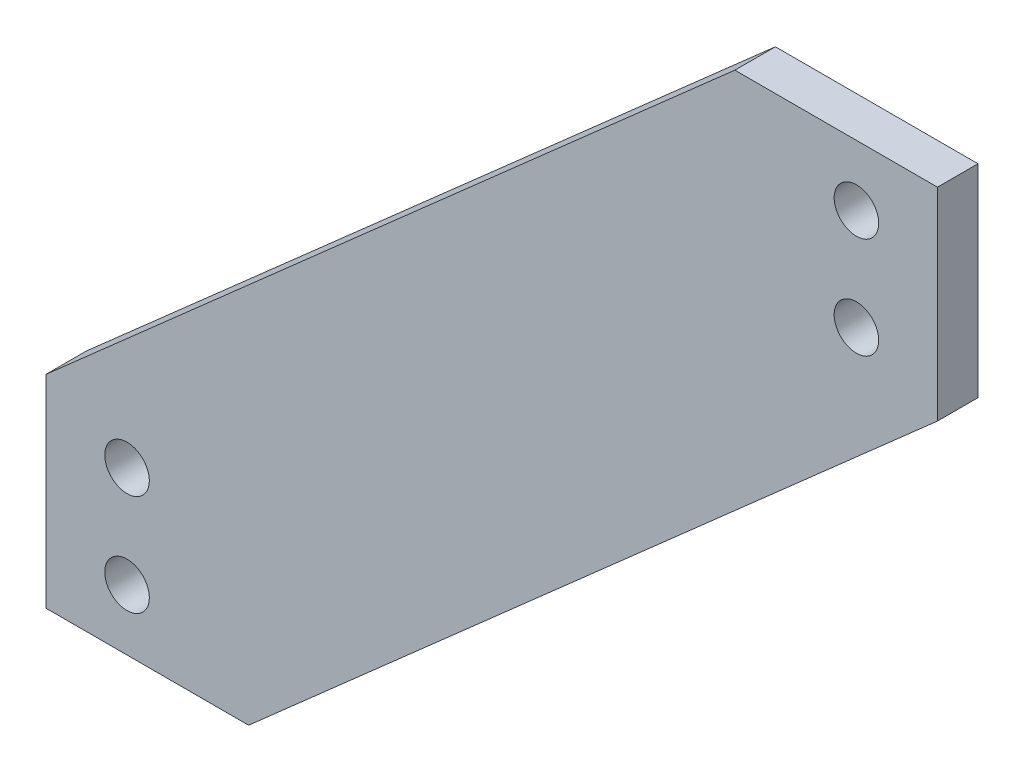
ISO-10303-21;
HEADER;
FILE_DESCRIPTION(('STEP AP214'),'2;1');
FILE_NAME('part.step','',(''),(''),'','','');
FILE_SCHEMA(('AUTOMOTIVE_DESIGN { 1 0 10303 214 1 1 1 1 }'));
ENDSEC;
DATA;
#1=APPLICATION_CONTEXT('core data for automotive mechanical design processes');
#2=APPLICATION_PROTOCOL_DEFINITION('international standard','automotive_design',2000,#1);
#3=PRODUCT_CONTEXT('',#1,'mechanical');
#4=PRODUCT('Part','Part','',(#3));
#5=PRODUCT_RELATED_PRODUCT_CATEGORY('part','',(#4));
#6=PRODUCT_DEFINITION_FORMATION('','',#4);
#7=PRODUCT_DEFINITION_CONTEXT('part definition',#1,'design');
#8=PRODUCT_DEFINITION('design','',#6,#7);
#9=PRODUCT_DEFINITION_SHAPE('','',#8);
#10=(LENGTH_UNIT() NAMED_UNIT(*) SI_UNIT(.MILLI.,.METRE.));
#11=(NAMED_UNIT(*) PLANE_ANGLE_UNIT() SI_UNIT($,.RADIAN.));
#12=(NAMED_UNIT(*) SI_UNIT($,.STERADIAN.) SOLID_ANGLE_UNIT());
#13=UNCERTAINTY_MEASURE_WITH_UNIT(LENGTH_MEASURE(1.E-05),#10,'distance_accuracy_value','');
#14=(GEOMETRIC_REPRESENTATION_CONTEXT(3) GLOBAL_UNCERTAINTY_ASSIGNED_CONTEXT((#13)) GLOBAL_UNIT_ASSIGNED_CONTEXT((#10,
#11,#12)) REPRESENTATION_CONTEXT('',''));
#15=CARTESIAN_POINT('',(0.,0.,0.));
#16=DIRECTION('',(0.,0.,1.));
#17=DIRECTION('',(1.,0.,0.));
#18=AXIS2_PLACEMENT_3D('',#15,#16,#17);
#19=CARTESIAN_POINT('',(0.,0.,-148.660687473185));
#20=DIRECTION('',(-1.,0.,0.));
#21=DIRECTION('',(0.,0.,1.));
#22=AXIS2_PLACEMENT_3D('',#19,#20,#21);
#23=PLANE('',#22);
#24=DIRECTION('',(0.,1.,0.));
#25=VECTOR('',#24,1.);
#26=CARTESIAN_POINT('',(0.,0.,0.));
#27=LINE('',#26,#25);
#28=CARTESIAN_POINT('',(0.,0.,0.));
#29=VERTEX_POINT('',#28);
#30=CARTESIAN_POINT('',(0.,25.,0.));
#31=VERTEX_POINT('',#30);
#32=EDGE_CURVE('E63',#29,#31,#27,.T.);
#33=ORIENTED_EDGE('',*,*,#32,.F.);
#34=DIRECTION('',(0.,0.,-1.));
#35=VECTOR('',#34,1.);
#36=CARTESIAN_POINT('',(0.,0.,5.));
#37=LINE('',#36,#35);
#38=CARTESIAN_POINT('',(0.,0.,5.));
#39=VERTEX_POINT('',#38);
#40=EDGE_CURVE('E11',#39,#29,#37,.T.);
#41=ORIENTED_EDGE('',*,*,#40,.F.);
#42=DIRECTION('',(0.,-1.,0.));
#43=VECTOR('',#42,1.);
#44=CARTESIAN_POINT('',(0.,0.,5.));
#45=LINE('',#44,#43);
#46=CARTESIAN_POINT('',(0.,25.,5.));
#47=VERTEX_POINT('',#46);
#48=EDGE_CURVE('E102',#47,#39,#45,.T.);
#49=ORIENTED_EDGE('',*,*,#48,.F.);
#50=DIRECTION('',(0.,0.,1.));
#51=VECTOR('',#50,1.);
#52=CARTESIAN_POINT('',(0.,25.,-148.660687473185));
#53=LINE('',#52,#51);
#54=EDGE_CURVE('E137',#31,#47,#53,.T.);
#55=ORIENTED_EDGE('',*,*,#54,.F.);
#56=EDGE_LOOP('',(#33,#41,#49,#55));
#57=FACE_BOUND('',#56,.T.);
#58=ADVANCED_FACE('F39',(#57),#23,.T.);
#59=CARTESIAN_POINT('',(0.,25.,-148.660687473185));
#60=DIRECTION('',(-0.661621637086846,0.749837855365093,0.));
#61=DIRECTION('',(-0.749837855365093,-0.661621637086846,0.));
#62=AXIS2_PLACEMENT_3D('',#59,#60,#61);
#63=PLANE('',#62);
#64=DIRECTION('',(0.749837855365093,0.661621637086846,0.));
#65=VECTOR('',#64,1.);
#66=CARTESIAN_POINT('',(0.,25.,0.));
#67=LINE('',#66,#65);
#68=CARTESIAN_POINT('',(85.,100.,0.));
#69=VERTEX_POINT('',#68);
#70=EDGE_CURVE('E163',#31,#69,#67,.T.);
#71=ORIENTED_EDGE('',*,*,#70,.F.);
#72=ORIENTED_EDGE('',*,*,#54,.T.);
#73=DIRECTION('',(-0.749837855365093,-0.661621637086846,0.));
#74=VECTOR('',#73,1.);
#75=CARTESIAN_POINT('',(0.,25.,5.));
#76=LINE('',#75,#74);
#77=CARTESIAN_POINT('',(85.,100.,5.));
#78=VERTEX_POINT('',#77);
#79=EDGE_CURVE('E125',#78,#47,#76,.T.);
#80=ORIENTED_EDGE('',*,*,#79,.F.);
#81=DIRECTION('',(0.,0.,1.));
#82=VECTOR('',#81,1.);
#83=CARTESIAN_POINT('',(85.,100.,-148.660687473185));
#84=LINE('',#83,#82);
#85=EDGE_CURVE('E140',#69,#78,#84,.T.);
#86=ORIENTED_EDGE('',*,*,#85,.F.);
#87=EDGE_LOOP('',(#71,#72,#80,#86));
#88=FACE_BOUND('',#87,.T.);
#89=ADVANCED_FACE('F168',(#88),#63,.T.);
#90=CARTESIAN_POINT('',(0.,0.,5.));
#91=DIRECTION('',(0.,1.,0.));
#92=DIRECTION('',(0.,0.,1.));
#93=AXIS2_PLACEMENT_3D('',#90,#91,#92);
#94=PLANE('',#93);
#95=DIRECTION('',(1.,0.,0.));
#96=VECTOR('',#95,1.);
#97=CARTESIAN_POINT('',(0.,0.,0.));
#98=LINE('',#97,#96);
#99=CARTESIAN_POINT('',(25.,0.,0.));
#100=VERTEX_POINT('',#99);
#101=EDGE_CURVE('E110',#29,#100,#98,.T.);
#102=ORIENTED_EDGE('',*,*,#101,.T.);
#103=DIRECTION('',(0.,0.,1.));
#104=VECTOR('',#103,1.);
#105=CARTESIAN_POINT('',(25.,0.,-148.660687473185));
#106=LINE('',#105,#104);
#107=CARTESIAN_POINT('',(25.,0.,5.));
#108=VERTEX_POINT('',#107);
#109=EDGE_CURVE('E109',#100,#108,#106,.T.);
#110=ORIENTED_EDGE('',*,*,#109,.T.);
#111=DIRECTION('',(1.,0.,0.));
#112=VECTOR('',#111,1.);
#113=CARTESIAN_POINT('',(0.,0.,5.));
#114=LINE('',#113,#112);
#115=EDGE_CURVE('E94',#39,#108,#114,.T.);
#116=ORIENTED_EDGE('',*,*,#115,.F.);
#117=ORIENTED_EDGE('',*,*,#40,.T.);
#118=EDGE_LOOP('',(#102,#110,#116,#117));
#119=FACE_BOUND('',#118,.T.);
#120=ADVANCED_FACE('F41',(#119),#94,.F.);
#121=CARTESIAN_POINT('',(110.,100.,5.));
#122=DIRECTION('',(0.,-1.,0.));
#123=DIRECTION('',(0.,0.,-1.));
#124=AXIS2_PLACEMENT_3D('',#121,#122,#123);
#125=PLANE('',#124);
#126=DIRECTION('',(-1.,0.,0.));
#127=VECTOR('',#126,1.);
#128=CARTESIAN_POINT('',(110.,100.,0.));
#129=LINE('',#128,#127);
#130=CARTESIAN_POINT('',(110.,100.,0.));
#131=VERTEX_POINT('',#130);
#132=EDGE_CURVE('E106',#131,#69,#129,.T.);
#133=ORIENTED_EDGE('',*,*,#132,.T.);
#134=ORIENTED_EDGE('',*,*,#85,.T.);
#135=DIRECTION('',(-1.,0.,0.));
#136=VECTOR('',#135,1.);
#137=CARTESIAN_POINT('',(110.,100.,5.));
#138=LINE('',#137,#136);
#139=CARTESIAN_POINT('',(110.,100.,5.));
#140=VERTEX_POINT('',#139);
#141=EDGE_CURVE('E105',#140,#78,#138,.T.);
#142=ORIENTED_EDGE('',*,*,#141,.F.);
#143=DIRECTION('',(0.,0.,-1.));
#144=VECTOR('',#143,1.);
#145=CARTESIAN_POINT('',(110.,100.,5.));
#146=LINE('',#145,#144);
#147=EDGE_CURVE('E48',#140,#131,#146,.T.);
#148=ORIENTED_EDGE('',*,*,#147,.T.);
#149=EDGE_LOOP('',(#133,#134,#142,#148));
#150=FACE_BOUND('',#149,.T.);
#151=ADVANCED_FACE('F158',(#150),#125,.F.);
#152=CARTESIAN_POINT('',(0.,0.,5.));
#153=DIRECTION('',(0.,0.,1.));
#154=DIRECTION('',(1.,0.,0.));
#155=AXIS2_PLACEMENT_3D('',#152,#153,#154);
#156=PLANE('',#155);
#157=CARTESIAN_POINT('',(100.,80.,5.));
#158=DIRECTION('',(0.,0.,1.));
#159=DIRECTION('',(1.,0.,0.));
#160=AXIS2_PLACEMENT_3D('',#157,#158,#159);
#161=CIRCLE('',#160,2.74999999999999);
#162=CARTESIAN_POINT('',(102.75,80.,5.));
#163=VERTEX_POINT('',#162);
#164=EDGE_CURVE('E295',#163,#163,#161,.T.);
#165=ORIENTED_EDGE('',*,*,#164,.F.);
#166=EDGE_LOOP('',(#165));
#167=FACE_BOUND('',#166,.T.);
#168=CARTESIAN_POINT('',(10.,20.,5.));
#169=DIRECTION('',(0.,0.,1.));
#170=DIRECTION('',(1.,0.,0.));
#171=AXIS2_PLACEMENT_3D('',#168,#169,#170);
#172=CIRCLE('',#171,2.74999999999999);
#173=CARTESIAN_POINT('',(12.75,20.,5.));
#174=VERTEX_POINT('',#173);
#175=EDGE_CURVE('E299',#174,#174,#172,.T.);
#176=ORIENTED_EDGE('',*,*,#175,.F.);
#177=EDGE_LOOP('',(#176));
#178=FACE_BOUND('',#177,.T.);
#179=CARTESIAN_POINT('',(10.,7.5,5.));
#180=DIRECTION('',(0.,0.,1.));
#181=DIRECTION('',(1.,0.,0.));
#182=AXIS2_PLACEMENT_3D('',#179,#180,#181);
#183=CIRCLE('',#182,2.74999999999999);
#184=CARTESIAN_POINT('',(12.75,7.5,5.));
#185=VERTEX_POINT('',#184);
#186=EDGE_CURVE('E309',#185,#185,#183,.T.);
#187=ORIENTED_EDGE('',*,*,#186,.F.);
#188=EDGE_LOOP('',(#187));
#189=FACE_BOUND('',#188,.T.);
#190=CARTESIAN_POINT('',(100.,92.5,5.));
#191=DIRECTION('',(0.,0.,1.));
#192=DIRECTION('',(1.,0.,0.));
#193=AXIS2_PLACEMENT_3D('',#190,#191,#192);
#194=CIRCLE('',#193,2.74999999999999);
#195=CARTESIAN_POINT('',(102.75,92.5,5.));
#196=VERTEX_POINT('',#195);
#197=EDGE_CURVE('E128',#196,#196,#194,.T.);
#198=ORIENTED_EDGE('',*,*,#197,.F.);
#199=EDGE_LOOP('',(#198));
#200=FACE_BOUND('',#199,.T.);
#201=ORIENTED_EDGE('',*,*,#141,.T.);
#202=ORIENTED_EDGE('',*,*,#79,.T.);
#203=ORIENTED_EDGE('',*,*,#48,.T.);
#204=ORIENTED_EDGE('',*,*,#115,.T.);
#205=DIRECTION('',(0.749837855365092,0.661621637086846,0.));
#206=VECTOR('',#205,1.);
#207=CARTESIAN_POINT('',(110.,75.,5.));
#208=LINE('',#207,#206);
#209=CARTESIAN_POINT('',(110.,75.,5.));
#210=VERTEX_POINT('',#209);
#211=EDGE_CURVE('E99',#108,#210,#208,.T.);
#212=ORIENTED_EDGE('',*,*,#211,.T.);
#213=DIRECTION('',(0.,1.,0.));
#214=VECTOR('',#213,1.);
#215=CARTESIAN_POINT('',(110.,100.,5.));
#216=LINE('',#215,#214);
#217=EDGE_CURVE('E120',#210,#140,#216,.T.);
#218=ORIENTED_EDGE('',*,*,#217,.T.);
#219=EDGE_LOOP('',(#201,#202,#203,#204,#212,#218));
#220=FACE_BOUND('',#219,.T.);
#221=ADVANCED_FACE('F96',(#167,#178,#189,#200,#220),#156,.T.);
#222=CARTESIAN_POINT('',(0.,0.,0.));
#223=DIRECTION('',(0.,0.,1.));
#224=DIRECTION('',(1.,0.,0.));
#225=AXIS2_PLACEMENT_3D('',#222,#223,#224);
#226=PLANE('',#225);
#227=CARTESIAN_POINT('',(100.,80.,0.));
#228=DIRECTION('',(0.,0.,1.));
#229=DIRECTION('',(1.,0.,0.));
#230=AXIS2_PLACEMENT_3D('',#227,#228,#229);
#231=CIRCLE('',#230,2.75);
#232=CARTESIAN_POINT('',(102.75,80.,0.));
#233=VERTEX_POINT('',#232);
#234=EDGE_CURVE('E292',#233,#233,#231,.T.);
#235=ORIENTED_EDGE('',*,*,#234,.T.);
#236=EDGE_LOOP('',(#235));
#237=FACE_BOUND('',#236,.T.);
#238=CARTESIAN_POINT('',(10.,20.,0.));
#239=DIRECTION('',(0.,0.,1.));
#240=DIRECTION('',(1.,0.,0.));
#241=AXIS2_PLACEMENT_3D('',#238,#239,#240);
#242=CIRCLE('',#241,2.75);
#243=CARTESIAN_POINT('',(12.75,20.,0.));
#244=VERTEX_POINT('',#243);
#245=EDGE_CURVE('E305',#244,#244,#242,.T.);
#246=ORIENTED_EDGE('',*,*,#245,.T.);
#247=EDGE_LOOP('',(#246));
#248=FACE_BOUND('',#247,.T.);
#249=CARTESIAN_POINT('',(10.,7.5,0.));
#250=DIRECTION('',(0.,0.,1.));
#251=DIRECTION('',(1.,0.,0.));
#252=AXIS2_PLACEMENT_3D('',#249,#250,#251);
#253=CIRCLE('',#252,2.75);
#254=CARTESIAN_POINT('',(12.75,7.5,0.));
#255=VERTEX_POINT('',#254);
#256=EDGE_CURVE('E313',#255,#255,#253,.T.);
#257=ORIENTED_EDGE('',*,*,#256,.T.);
#258=EDGE_LOOP('',(#257));
#259=FACE_BOUND('',#258,.T.);
#260=CARTESIAN_POINT('',(100.,92.5,0.));
#261=DIRECTION('',(0.,0.,1.));
#262=DIRECTION('',(1.,0.,0.));
#263=AXIS2_PLACEMENT_3D('',#260,#261,#262);
#264=CIRCLE('',#263,2.75);
#265=CARTESIAN_POINT('',(102.75,92.5,0.));
#266=VERTEX_POINT('',#265);
#267=EDGE_CURVE('E121',#266,#266,#264,.T.);
#268=ORIENTED_EDGE('',*,*,#267,.T.);
#269=EDGE_LOOP('',(#268));
#270=FACE_BOUND('',#269,.T.);
#271=ORIENTED_EDGE('',*,*,#101,.F.);
#272=ORIENTED_EDGE('',*,*,#32,.T.);
#273=ORIENTED_EDGE('',*,*,#70,.T.);
#274=ORIENTED_EDGE('',*,*,#132,.F.);
#275=DIRECTION('',(0.,-1.,0.));
#276=VECTOR('',#275,1.);
#277=CARTESIAN_POINT('',(110.,100.,0.));
#278=LINE('',#277,#276);
#279=CARTESIAN_POINT('',(110.,75.,0.));
#280=VERTEX_POINT('',#279);
#281=EDGE_CURVE('E55',#131,#280,#278,.T.);
#282=ORIENTED_EDGE('',*,*,#281,.T.);
#283=DIRECTION('',(-0.749837855365092,-0.661621637086847,0.));
#284=VECTOR('',#283,1.);
#285=CARTESIAN_POINT('',(110.,75.,0.));
#286=LINE('',#285,#284);
#287=EDGE_CURVE('E146',#280,#100,#286,.T.);
#288=ORIENTED_EDGE('',*,*,#287,.T.);
#289=EDGE_LOOP('',(#271,#272,#273,#274,#282,#288));
#290=FACE_BOUND('',#289,.T.);
#291=ADVANCED_FACE('F161',(#237,#248,#259,#270,#290),#226,.F.);
#292=CARTESIAN_POINT('',(110.,75.,-148.660687473185));
#293=DIRECTION('',(0.661621637086847,-0.749837855365092,0.));
#294=DIRECTION('',(0.749837855365092,0.661621637086847,0.));
#295=AXIS2_PLACEMENT_3D('',#292,#293,#294);
#296=PLANE('',#295);
#297=ORIENTED_EDGE('',*,*,#287,.F.);
#298=DIRECTION('',(0.,0.,1.));
#299=VECTOR('',#298,1.);
#300=CARTESIAN_POINT('',(110.,75.,-148.660687473185));
#301=LINE('',#300,#299);
#302=EDGE_CURVE('E115',#280,#210,#301,.T.);
#303=ORIENTED_EDGE('',*,*,#302,.T.);
#304=ORIENTED_EDGE('',*,*,#211,.F.);
#305=ORIENTED_EDGE('',*,*,#109,.F.);
#306=EDGE_LOOP('',(#297,#303,#304,#305));
#307=FACE_BOUND('',#306,.T.);
#308=ADVANCED_FACE('F117',(#307),#296,.T.);
#309=CARTESIAN_POINT('',(110.,100.,-148.660687473185));
#310=DIRECTION('',(1.,0.,0.));
#311=DIRECTION('',(0.,1.,0.));
#312=AXIS2_PLACEMENT_3D('',#309,#310,#311);
#313=PLANE('',#312);
#314=ORIENTED_EDGE('',*,*,#281,.F.);
#315=ORIENTED_EDGE('',*,*,#147,.F.);
#316=ORIENTED_EDGE('',*,*,#217,.F.);
#317=ORIENTED_EDGE('',*,*,#302,.F.);
#318=EDGE_LOOP('',(#314,#315,#316,#317));
#319=FACE_BOUND('',#318,.T.);
#320=ADVANCED_FACE('F179',(#319),#313,.T.);
#321=CARTESIAN_POINT('',(100.,92.5,5.));
#322=DIRECTION('',(0.,0.,1.));
#323=DIRECTION('',(1.,0.,0.));
#324=AXIS2_PLACEMENT_3D('',#321,#322,#323);
#325=CYLINDRICAL_SURFACE('',#324,2.75);
#326=ORIENTED_EDGE('',*,*,#267,.F.);
#327=EDGE_LOOP('',(#326));
#328=FACE_BOUND('',#327,.T.);
#329=ORIENTED_EDGE('',*,*,#197,.T.);
#330=EDGE_LOOP('',(#329));
#331=FACE_BOUND('',#330,.T.);
#332=ADVANCED_FACE('F176',(#328,#331),#325,.F.);
#333=CARTESIAN_POINT('',(10.,7.5,5.));
#334=DIRECTION('',(0.,0.,1.));
#335=DIRECTION('',(1.,0.,0.));
#336=AXIS2_PLACEMENT_3D('',#333,#334,#335);
#337=CYLINDRICAL_SURFACE('',#336,2.74999999999999);
#338=ORIENTED_EDGE('',*,*,#256,.F.);
#339=EDGE_LOOP('',(#338));
#340=FACE_BOUND('',#339,.T.);
#341=ORIENTED_EDGE('',*,*,#186,.T.);
#342=EDGE_LOOP('',(#341));
#343=FACE_BOUND('',#342,.T.);
#344=ADVANCED_FACE('F257',(#340,#343),#337,.F.);
#345=CARTESIAN_POINT('',(10.,20.,5.));
#346=DIRECTION('',(0.,0.,1.));
#347=DIRECTION('',(1.,0.,0.));
#348=AXIS2_PLACEMENT_3D('',#345,#346,#347);
#349=CYLINDRICAL_SURFACE('',#348,2.74999999999999);
#350=ORIENTED_EDGE('',*,*,#245,.F.);
#351=EDGE_LOOP('',(#350));
#352=FACE_BOUND('',#351,.T.);
#353=ORIENTED_EDGE('',*,*,#175,.T.);
#354=EDGE_LOOP('',(#353));
#355=FACE_BOUND('',#354,.T.);
#356=ADVANCED_FACE('F266',(#352,#355),#349,.F.);
#357=CARTESIAN_POINT('',(100.,80.,5.));
#358=DIRECTION('',(0.,0.,1.));
#359=DIRECTION('',(1.,0.,0.));
#360=AXIS2_PLACEMENT_3D('',#357,#358,#359);
#361=CYLINDRICAL_SURFACE('',#360,2.75);
#362=ORIENTED_EDGE('',*,*,#234,.F.);
#363=EDGE_LOOP('',(#362));
#364=FACE_BOUND('',#363,.T.);
#365=ORIENTED_EDGE('',*,*,#164,.T.);
#366=EDGE_LOOP('',(#365));
#367=FACE_BOUND('',#366,.T.);
#368=ADVANCED_FACE('F275',(#364,#367),#361,.F.);
#369=CLOSED_SHELL('',(#58,#89,#120,#151,#221,#291,#308,#320,#332,#344,#356,#368));
#370=MANIFOLD_SOLID_BREP('B2',#369);
#371=ADVANCED_BREP_SHAPE_REPRESENTATION('',(#18,#370),#14);
#372=SHAPE_DEFINITION_REPRESENTATION(#9,#371);
ENDSEC;
END-ISO-10303-21;
